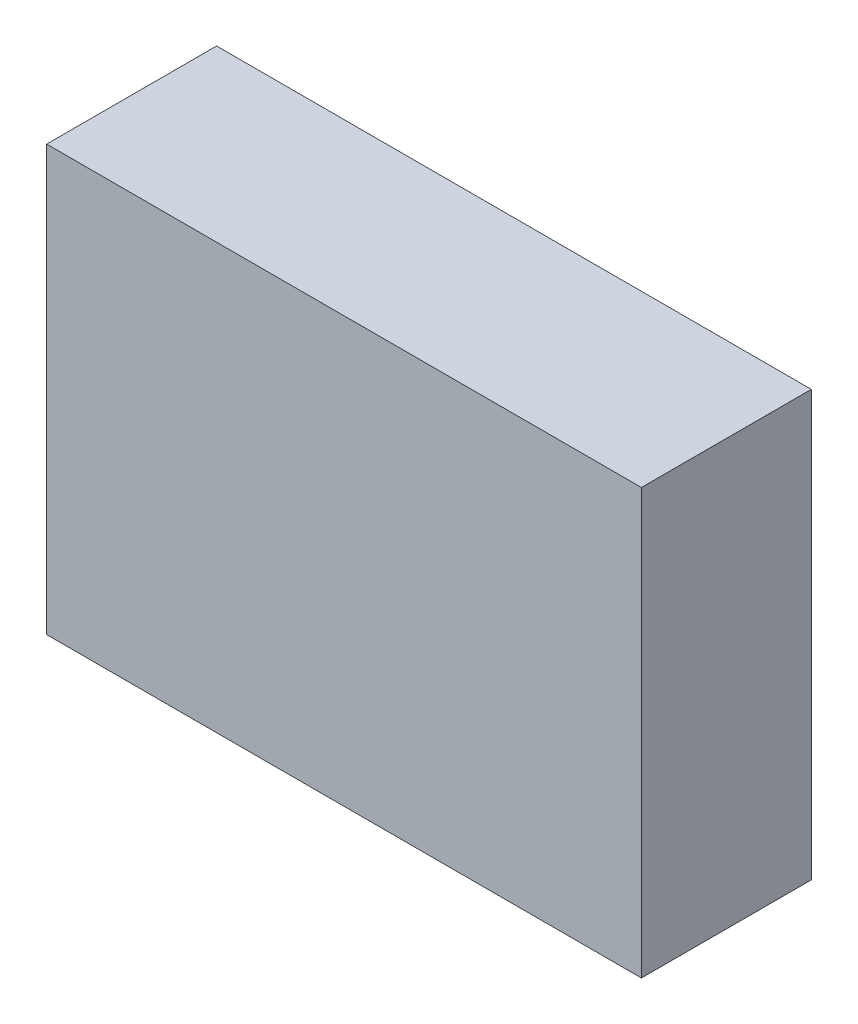
ISO-10303-21;
HEADER;
FILE_DESCRIPTION(('STEP AP214'),'2;1');
FILE_NAME('part.step','',(''),(''),'','','');
FILE_SCHEMA(('AUTOMOTIVE_DESIGN { 1 0 10303 214 1 1 1 1 }'));
ENDSEC;
DATA;
#1=APPLICATION_CONTEXT('core data for automotive mechanical design processes');
#2=APPLICATION_PROTOCOL_DEFINITION('international standard','automotive_design',2000,#1);
#3=PRODUCT_CONTEXT('',#1,'mechanical');
#4=PRODUCT('Part','Part','',(#3));
#5=PRODUCT_RELATED_PRODUCT_CATEGORY('part','',(#4));
#6=PRODUCT_DEFINITION_FORMATION('','',#4);
#7=PRODUCT_DEFINITION_CONTEXT('part definition',#1,'design');
#8=PRODUCT_DEFINITION('design','',#6,#7);
#9=PRODUCT_DEFINITION_SHAPE('','',#8);
#10=(LENGTH_UNIT() NAMED_UNIT(*) SI_UNIT(.MILLI.,.METRE.));
#11=(NAMED_UNIT(*) PLANE_ANGLE_UNIT() SI_UNIT($,.RADIAN.));
#12=(NAMED_UNIT(*) SI_UNIT($,.STERADIAN.) SOLID_ANGLE_UNIT());
#13=UNCERTAINTY_MEASURE_WITH_UNIT(LENGTH_MEASURE(1.E-05),#10,'distance_accuracy_value','');
#14=(GEOMETRIC_REPRESENTATION_CONTEXT(3) GLOBAL_UNCERTAINTY_ASSIGNED_CONTEXT((#13)) GLOBAL_UNIT_ASSIGNED_CONTEXT((#10,
#11,#12)) REPRESENTATION_CONTEXT('',''));
#15=CARTESIAN_POINT('',(0.,0.,0.));
#16=DIRECTION('',(0.,0.,1.));
#17=DIRECTION('',(1.,0.,0.));
#18=AXIS2_PLACEMENT_3D('',#15,#16,#17);
#19=CARTESIAN_POINT('',(-3.5,2.85085630010856,2.));
#20=DIRECTION('',(1.,0.,0.));
#21=DIRECTION('',(0.,1.,0.));
#22=AXIS2_PLACEMENT_3D('',#19,#20,#21);
#23=PLANE('',#22);
#24=DIRECTION('',(0.,-1.,0.));
#25=VECTOR('',#24,1.);
#26=CARTESIAN_POINT('',(-3.5,2.85085630010856,0.));
#27=LINE('',#26,#25);
#28=CARTESIAN_POINT('',(-3.5,2.85085630010856,0.));
#29=VERTEX_POINT('',#28);
#30=CARTESIAN_POINT('',(-3.5,-2.14914369989144,0.));
#31=VERTEX_POINT('',#30);
#32=EDGE_CURVE('E163',#29,#31,#27,.T.);
#33=ORIENTED_EDGE('',*,*,#32,.T.);
#34=DIRECTION('',(0.,0.,-1.));
#35=VECTOR('',#34,1.);
#36=CARTESIAN_POINT('',(-3.5,-2.14914369989144,2.));
#37=LINE('',#36,#35);
#38=CARTESIAN_POINT('',(-3.5,-2.14914369989144,2.));
#39=VERTEX_POINT('',#38);
#40=EDGE_CURVE('E11',#39,#31,#37,.T.);
#41=ORIENTED_EDGE('',*,*,#40,.F.);
#42=DIRECTION('',(0.,-1.,0.));
#43=VECTOR('',#42,1.);
#44=CARTESIAN_POINT('',(-3.5,2.85085630010856,2.));
#45=LINE('',#44,#43);
#46=CARTESIAN_POINT('',(-3.5,2.85085630010856,2.));
#47=VERTEX_POINT('',#46);
#48=EDGE_CURVE('E169',#47,#39,#45,.T.);
#49=ORIENTED_EDGE('',*,*,#48,.F.);
#50=DIRECTION('',(0.,0.,-1.));
#51=VECTOR('',#50,1.);
#52=CARTESIAN_POINT('',(-3.5,2.85085630010856,2.));
#53=LINE('',#52,#51);
#54=EDGE_CURVE('E179',#47,#29,#53,.T.);
#55=ORIENTED_EDGE('',*,*,#54,.T.);
#56=EDGE_LOOP('',(#33,#41,#49,#55));
#57=FACE_BOUND('',#56,.T.);
#58=ADVANCED_FACE('F44',(#57),#23,.F.);
#59=CARTESIAN_POINT('',(-3.5,-2.14914369989144,2.));
#60=DIRECTION('',(0.,1.,0.));
#61=DIRECTION('',(-1.,0.,0.));
#62=AXIS2_PLACEMENT_3D('',#59,#60,#61);
#63=PLANE('',#62);
#64=DIRECTION('',(1.,0.,0.));
#65=VECTOR('',#64,1.);
#66=CARTESIAN_POINT('',(-3.25,-2.14914369989144,0.25));
#67=LINE('',#66,#65);
#68=CARTESIAN_POINT('',(-3.25,-2.14914369989144,0.25));
#69=VERTEX_POINT('',#68);
#70=CARTESIAN_POINT('',(3.25,-2.14914369989144,0.25));
#71=VERTEX_POINT('',#70);
#72=EDGE_CURVE('E154',#69,#71,#67,.T.);
#73=ORIENTED_EDGE('',*,*,#72,.F.);
#74=DIRECTION('',(0.,0.,-1.));
#75=VECTOR('',#74,1.);
#76=CARTESIAN_POINT('',(-3.25,-2.14914369989144,1.75));
#77=LINE('',#76,#75);
#78=CARTESIAN_POINT('',(-3.25,-2.14914369989144,1.75));
#79=VERTEX_POINT('',#78);
#80=EDGE_CURVE('E59',#79,#69,#77,.T.);
#81=ORIENTED_EDGE('',*,*,#80,.F.);
#82=DIRECTION('',(-1.,0.,0.));
#83=VECTOR('',#82,1.);
#84=CARTESIAN_POINT('',(-3.25,-2.14914369989144,1.75));
#85=LINE('',#84,#83);
#86=CARTESIAN_POINT('',(3.25,-2.14914369989144,1.75));
#87=VERTEX_POINT('',#86);
#88=EDGE_CURVE('E141',#87,#79,#85,.T.);
#89=ORIENTED_EDGE('',*,*,#88,.F.);
#90=DIRECTION('',(0.,0.,1.));
#91=VECTOR('',#90,1.);
#92=CARTESIAN_POINT('',(3.25,-2.14914369989144,1.75));
#93=LINE('',#92,#91);
#94=EDGE_CURVE('E145',#71,#87,#93,.T.);
#95=ORIENTED_EDGE('',*,*,#94,.F.);
#96=EDGE_LOOP('',(#73,#81,#89,#95));
#97=FACE_BOUND('',#96,.T.);
#98=DIRECTION('',(1.,0.,0.));
#99=VECTOR('',#98,1.);
#100=CARTESIAN_POINT('',(-3.5,-2.14914369989144,0.));
#101=LINE('',#100,#99);
#102=CARTESIAN_POINT('',(3.5,-2.14914369989144,0.));
#103=VERTEX_POINT('',#102);
#104=EDGE_CURVE('E183',#31,#103,#101,.T.);
#105=ORIENTED_EDGE('',*,*,#104,.T.);
#106=DIRECTION('',(0.,0.,-1.));
#107=VECTOR('',#106,1.);
#108=CARTESIAN_POINT('',(3.5,-2.14914369989144,2.));
#109=LINE('',#108,#107);
#110=CARTESIAN_POINT('',(3.5,-2.14914369989144,2.));
#111=VERTEX_POINT('',#110);
#112=EDGE_CURVE('E52',#111,#103,#109,.T.);
#113=ORIENTED_EDGE('',*,*,#112,.F.);
#114=DIRECTION('',(1.,0.,0.));
#115=VECTOR('',#114,1.);
#116=CARTESIAN_POINT('',(-3.5,-2.14914369989144,2.));
#117=LINE('',#116,#115);
#118=EDGE_CURVE('E96',#39,#111,#117,.T.);
#119=ORIENTED_EDGE('',*,*,#118,.F.);
#120=ORIENTED_EDGE('',*,*,#40,.T.);
#121=EDGE_LOOP('',(#105,#113,#119,#120));
#122=FACE_BOUND('',#121,.T.);
#123=ADVANCED_FACE('F217',(#97,#122),#63,.F.);
#124=CARTESIAN_POINT('',(3.5,2.85085630010856,2.));
#125=DIRECTION('',(-1.,0.,0.));
#126=DIRECTION('',(0.,-1.,0.));
#127=AXIS2_PLACEMENT_3D('',#124,#125,#126);
#128=PLANE('',#127);
#129=DIRECTION('',(0.,1.,0.));
#130=VECTOR('',#129,1.);
#131=CARTESIAN_POINT('',(3.5,2.85085630010856,0.));
#132=LINE('',#131,#130);
#133=CARTESIAN_POINT('',(3.5,2.85085630010856,0.));
#134=VERTEX_POINT('',#133);
#135=EDGE_CURVE('E186',#103,#134,#132,.T.);
#136=ORIENTED_EDGE('',*,*,#135,.T.);
#137=DIRECTION('',(0.,0.,-1.));
#138=VECTOR('',#137,1.);
#139=CARTESIAN_POINT('',(3.5,2.85085630010856,2.));
#140=LINE('',#139,#138);
#141=CARTESIAN_POINT('',(3.5,2.85085630010856,2.));
#142=VERTEX_POINT('',#141);
#143=EDGE_CURVE('E193',#142,#134,#140,.T.);
#144=ORIENTED_EDGE('',*,*,#143,.F.);
#145=DIRECTION('',(0.,1.,0.));
#146=VECTOR('',#145,1.);
#147=CARTESIAN_POINT('',(3.5,2.85085630010856,2.));
#148=LINE('',#147,#146);
#149=EDGE_CURVE('E174',#111,#142,#148,.T.);
#150=ORIENTED_EDGE('',*,*,#149,.F.);
#151=ORIENTED_EDGE('',*,*,#112,.T.);
#152=EDGE_LOOP('',(#136,#144,#150,#151));
#153=FACE_BOUND('',#152,.T.);
#154=ADVANCED_FACE('F200',(#153),#128,.F.);
#155=CARTESIAN_POINT('',(-3.5,2.85085630010856,2.));
#156=DIRECTION('',(0.,-1.,0.));
#157=DIRECTION('',(1.,0.,0.));
#158=AXIS2_PLACEMENT_3D('',#155,#156,#157);
#159=PLANE('',#158);
#160=DIRECTION('',(-1.,0.,0.));
#161=VECTOR('',#160,1.);
#162=CARTESIAN_POINT('',(-3.5,2.85085630010856,0.));
#163=LINE('',#162,#161);
#164=EDGE_CURVE('E89',#134,#29,#163,.T.);
#165=ORIENTED_EDGE('',*,*,#164,.T.);
#166=ORIENTED_EDGE('',*,*,#54,.F.);
#167=DIRECTION('',(-1.,0.,0.));
#168=VECTOR('',#167,1.);
#169=CARTESIAN_POINT('',(-3.5,2.85085630010856,2.));
#170=LINE('',#169,#168);
#171=EDGE_CURVE('E68',#142,#47,#170,.T.);
#172=ORIENTED_EDGE('',*,*,#171,.F.);
#173=ORIENTED_EDGE('',*,*,#143,.T.);
#174=EDGE_LOOP('',(#165,#166,#172,#173));
#175=FACE_BOUND('',#174,.T.);
#176=ADVANCED_FACE('F208',(#175),#159,.F.);
#177=CARTESIAN_POINT('',(0.,0.,2.));
#178=DIRECTION('',(0.,0.,1.));
#179=DIRECTION('',(1.,0.,0.));
#180=AXIS2_PLACEMENT_3D('',#177,#178,#179);
#181=PLANE('',#180);
#182=ORIENTED_EDGE('',*,*,#48,.T.);
#183=ORIENTED_EDGE('',*,*,#118,.T.);
#184=ORIENTED_EDGE('',*,*,#149,.T.);
#185=ORIENTED_EDGE('',*,*,#171,.T.);
#186=EDGE_LOOP('',(#182,#183,#184,#185));
#187=FACE_BOUND('',#186,.T.);
#188=ADVANCED_FACE('F210',(#187),#181,.T.);
#189=CARTESIAN_POINT('',(0.,0.,0.));
#190=DIRECTION('',(0.,0.,1.));
#191=DIRECTION('',(1.,0.,0.));
#192=AXIS2_PLACEMENT_3D('',#189,#190,#191);
#193=PLANE('',#192);
#194=ORIENTED_EDGE('',*,*,#32,.F.);
#195=ORIENTED_EDGE('',*,*,#164,.F.);
#196=ORIENTED_EDGE('',*,*,#135,.F.);
#197=ORIENTED_EDGE('',*,*,#104,.F.);
#198=EDGE_LOOP('',(#194,#195,#196,#197));
#199=FACE_BOUND('',#198,.T.);
#200=ADVANCED_FACE('F204',(#199),#193,.F.);
#201=CARTESIAN_POINT('',(-3.25,-1.64914369989144,1.75));
#202=DIRECTION('',(-1.,0.,0.));
#203=DIRECTION('',(0.,-1.,0.));
#204=AXIS2_PLACEMENT_3D('',#201,#202,#203);
#205=PLANE('',#204);
#206=ORIENTED_EDGE('',*,*,#80,.T.);
#207=DIRECTION('',(0.,-1.,0.));
#208=VECTOR('',#207,1.);
#209=CARTESIAN_POINT('',(-3.25,-1.64914369989144,0.25));
#210=LINE('',#209,#208);
#211=CARTESIAN_POINT('',(-3.25,-1.64914369989144,0.25));
#212=VERTEX_POINT('',#211);
#213=EDGE_CURVE('E116',#212,#69,#210,.T.);
#214=ORIENTED_EDGE('',*,*,#213,.F.);
#215=DIRECTION('',(0.,0.,-1.));
#216=VECTOR('',#215,1.);
#217=CARTESIAN_POINT('',(-3.25,-1.64914369989144,1.75));
#218=LINE('',#217,#216);
#219=CARTESIAN_POINT('',(-3.25,-1.64914369989144,1.75));
#220=VERTEX_POINT('',#219);
#221=EDGE_CURVE('E120',#220,#212,#218,.T.);
#222=ORIENTED_EDGE('',*,*,#221,.F.);
#223=DIRECTION('',(0.,-1.,0.));
#224=VECTOR('',#223,1.);
#225=CARTESIAN_POINT('',(-3.25,-1.64914369989144,1.75));
#226=LINE('',#225,#224);
#227=EDGE_CURVE('E160',#220,#79,#226,.T.);
#228=ORIENTED_EDGE('',*,*,#227,.T.);
#229=EDGE_LOOP('',(#206,#214,#222,#228));
#230=FACE_BOUND('',#229,.T.);
#231=ADVANCED_FACE('F118',(#230),#205,.F.);
#232=CARTESIAN_POINT('',(-3.25,-1.64914369989144,1.75));
#233=DIRECTION('',(0.,0.,1.));
#234=DIRECTION('',(1.,0.,0.));
#235=AXIS2_PLACEMENT_3D('',#232,#233,#234);
#236=PLANE('',#235);
#237=ORIENTED_EDGE('',*,*,#88,.T.);
#238=ORIENTED_EDGE('',*,*,#227,.F.);
#239=DIRECTION('',(-1.,0.,0.));
#240=VECTOR('',#239,1.);
#241=CARTESIAN_POINT('',(-3.25,-1.64914369989144,1.75));
#242=LINE('',#241,#240);
#243=CARTESIAN_POINT('',(3.25,-1.64914369989144,1.75));
#244=VERTEX_POINT('',#243);
#245=EDGE_CURVE('E127',#244,#220,#242,.T.);
#246=ORIENTED_EDGE('',*,*,#245,.F.);
#247=DIRECTION('',(0.,-1.,0.));
#248=VECTOR('',#247,1.);
#249=CARTESIAN_POINT('',(3.25,-1.64914369989144,1.75));
#250=LINE('',#249,#248);
#251=EDGE_CURVE('E164',#244,#87,#250,.T.);
#252=ORIENTED_EDGE('',*,*,#251,.T.);
#253=EDGE_LOOP('',(#237,#238,#246,#252));
#254=FACE_BOUND('',#253,.T.);
#255=ADVANCED_FACE('F234',(#254),#236,.F.);
#256=CARTESIAN_POINT('',(3.25,-1.64914369989144,1.75));
#257=DIRECTION('',(1.,0.,0.));
#258=DIRECTION('',(0.,1.,0.));
#259=AXIS2_PLACEMENT_3D('',#256,#257,#258);
#260=PLANE('',#259);
#261=ORIENTED_EDGE('',*,*,#94,.T.);
#262=ORIENTED_EDGE('',*,*,#251,.F.);
#263=DIRECTION('',(0.,0.,1.));
#264=VECTOR('',#263,1.);
#265=CARTESIAN_POINT('',(3.25,-1.64914369989144,1.75));
#266=LINE('',#265,#264);
#267=CARTESIAN_POINT('',(3.25,-1.64914369989144,0.25));
#268=VERTEX_POINT('',#267);
#269=EDGE_CURVE('E136',#268,#244,#266,.T.);
#270=ORIENTED_EDGE('',*,*,#269,.F.);
#271=DIRECTION('',(0.,-1.,0.));
#272=VECTOR('',#271,1.);
#273=CARTESIAN_POINT('',(3.25,-1.64914369989144,0.25));
#274=LINE('',#273,#272);
#275=EDGE_CURVE('E126',#268,#71,#274,.T.);
#276=ORIENTED_EDGE('',*,*,#275,.T.);
#277=EDGE_LOOP('',(#261,#262,#270,#276));
#278=FACE_BOUND('',#277,.T.);
#279=ADVANCED_FACE('F232',(#278),#260,.F.);
#280=CARTESIAN_POINT('',(-3.25,-1.64914369989144,0.25));
#281=DIRECTION('',(0.,0.,-1.));
#282=DIRECTION('',(-1.,0.,0.));
#283=AXIS2_PLACEMENT_3D('',#280,#281,#282);
#284=PLANE('',#283);
#285=ORIENTED_EDGE('',*,*,#72,.T.);
#286=ORIENTED_EDGE('',*,*,#275,.F.);
#287=DIRECTION('',(1.,0.,0.));
#288=VECTOR('',#287,1.);
#289=CARTESIAN_POINT('',(-3.25,-1.64914369989144,0.25));
#290=LINE('',#289,#288);
#291=EDGE_CURVE('E130',#212,#268,#290,.T.);
#292=ORIENTED_EDGE('',*,*,#291,.F.);
#293=ORIENTED_EDGE('',*,*,#213,.T.);
#294=EDGE_LOOP('',(#285,#286,#292,#293));
#295=FACE_BOUND('',#294,.T.);
#296=ADVANCED_FACE('F131',(#295),#284,.F.);
#297=CARTESIAN_POINT('',(0.,-1.64914369989144,0.));
#298=DIRECTION('',(0.,-1.,0.));
#299=DIRECTION('',(0.,0.,-1.));
#300=AXIS2_PLACEMENT_3D('',#297,#298,#299);
#301=PLANE('',#300);
#302=ORIENTED_EDGE('',*,*,#221,.T.);
#303=ORIENTED_EDGE('',*,*,#291,.T.);
#304=ORIENTED_EDGE('',*,*,#269,.T.);
#305=ORIENTED_EDGE('',*,*,#245,.T.);
#306=EDGE_LOOP('',(#302,#303,#304,#305));
#307=FACE_BOUND('',#306,.T.);
#308=ADVANCED_FACE('F138',(#307),#301,.T.);
#309=CLOSED_SHELL('',(#58,#123,#154,#176,#188,#200,#231,#255,#279,#296,#308));
#310=MANIFOLD_SOLID_BREP('B2',#309);
#311=ADVANCED_BREP_SHAPE_REPRESENTATION('',(#18,#310),#14);
#312=SHAPE_DEFINITION_REPRESENTATION(#9,#311);
ENDSEC;
END-ISO-10303-21;
